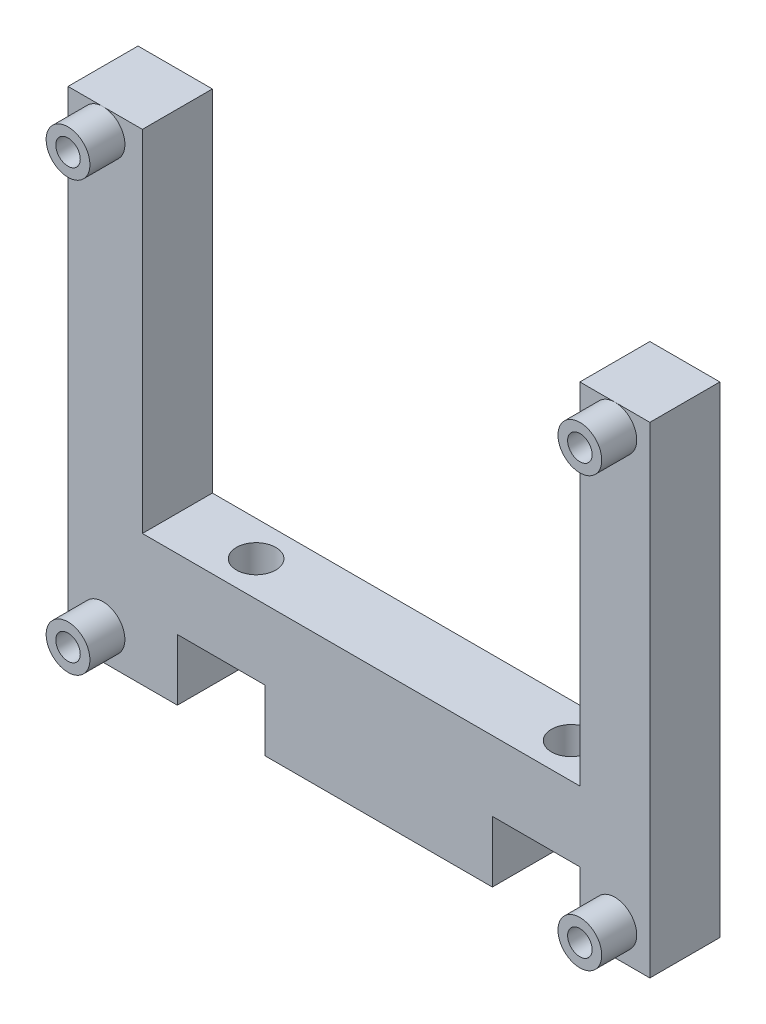
ISO-10303-21;
HEADER;
FILE_DESCRIPTION(('STEP AP214'),'2;1');
FILE_NAME('part.step','',(''),(''),'','','');
FILE_SCHEMA(('AUTOMOTIVE_DESIGN { 1 0 10303 214 1 1 1 1 }'));
ENDSEC;
DATA;
#1=APPLICATION_CONTEXT('core data for automotive mechanical design processes');
#2=APPLICATION_PROTOCOL_DEFINITION('international standard','automotive_design',2000,#1);
#3=PRODUCT_CONTEXT('',#1,'mechanical');
#4=PRODUCT('Part','Part','',(#3));
#5=PRODUCT_RELATED_PRODUCT_CATEGORY('part','',(#4));
#6=PRODUCT_DEFINITION_FORMATION('','',#4);
#7=PRODUCT_DEFINITION_CONTEXT('part definition',#1,'design');
#8=PRODUCT_DEFINITION('design','',#6,#7);
#9=PRODUCT_DEFINITION_SHAPE('','',#8);
#10=(LENGTH_UNIT() NAMED_UNIT(*) SI_UNIT(.MILLI.,.METRE.));
#11=(NAMED_UNIT(*) PLANE_ANGLE_UNIT() SI_UNIT($,.RADIAN.));
#12=(NAMED_UNIT(*) SI_UNIT($,.STERADIAN.) SOLID_ANGLE_UNIT());
#13=UNCERTAINTY_MEASURE_WITH_UNIT(LENGTH_MEASURE(1.E-05),#10,'distance_accuracy_value','');
#14=(GEOMETRIC_REPRESENTATION_CONTEXT(3) GLOBAL_UNCERTAINTY_ASSIGNED_CONTEXT((#13)) GLOBAL_UNIT_ASSIGNED_CONTEXT((#10,
#11,#12)) REPRESENTATION_CONTEXT('',''));
#15=CARTESIAN_POINT('',(0.,0.,0.));
#16=DIRECTION('',(0.,0.,1.));
#17=DIRECTION('',(1.,0.,0.));
#18=AXIS2_PLACEMENT_3D('',#15,#16,#17);
#19=CARTESIAN_POINT('',(33.25,-28.,-8.));
#20=DIRECTION('',(0.,-1.,0.));
#21=DIRECTION('',(1.,0.,0.));
#22=AXIS2_PLACEMENT_3D('',#19,#20,#21);
#23=PLANE('',#22);
#24=DIRECTION('',(0.,0.,-1.));
#25=VECTOR('',#24,1.);
#26=CARTESIAN_POINT('',(-20.75,-28.,0.));
#27=LINE('',#26,#25);
#28=CARTESIAN_POINT('',(-20.75,-28.,0.));
#29=VERTEX_POINT('',#28);
#30=CARTESIAN_POINT('',(-20.75,-28.,-8.));
#31=VERTEX_POINT('',#30);
#32=EDGE_CURVE('E164',#29,#31,#27,.T.);
#33=ORIENTED_EDGE('',*,*,#32,.F.);
#34=DIRECTION('',(1.,0.,0.));
#35=VECTOR('',#34,1.);
#36=CARTESIAN_POINT('',(33.25,-28.,0.));
#37=LINE('',#36,#35);
#38=CARTESIAN_POINT('',(-33.25,-28.,0.));
#39=VERTEX_POINT('',#38);
#40=EDGE_CURVE('E294',#39,#29,#37,.T.);
#41=ORIENTED_EDGE('',*,*,#40,.F.);
#42=DIRECTION('',(0.,0.,1.));
#43=VECTOR('',#42,1.);
#44=CARTESIAN_POINT('',(-33.25,-28.,-8.));
#45=LINE('',#44,#43);
#46=CARTESIAN_POINT('',(-33.25,-28.,-8.));
#47=VERTEX_POINT('',#46);
#48=EDGE_CURVE('E306',#47,#39,#45,.T.);
#49=ORIENTED_EDGE('',*,*,#48,.F.);
#50=DIRECTION('',(1.,0.,0.));
#51=VECTOR('',#50,1.);
#52=CARTESIAN_POINT('',(33.25,-28.,-8.));
#53=LINE('',#52,#51);
#54=EDGE_CURVE('E269',#47,#31,#53,.T.);
#55=ORIENTED_EDGE('',*,*,#54,.T.);
#56=EDGE_LOOP('',(#33,#41,#49,#55));
#57=FACE_BOUND('',#56,.T.);
#58=ADVANCED_FACE('F37',(#57),#23,.T.);
#59=DIRECTION('',(0.,0.,1.));
#60=VECTOR('',#59,1.);
#61=CARTESIAN_POINT('',(-10.75,-28.,0.));
#62=LINE('',#61,#60);
#63=CARTESIAN_POINT('',(-10.75,-28.,-8.));
#64=VERTEX_POINT('',#63);
#65=CARTESIAN_POINT('',(-10.75,-28.,0.));
#66=VERTEX_POINT('',#65);
#67=EDGE_CURVE('E178',#64,#66,#62,.T.);
#68=ORIENTED_EDGE('',*,*,#67,.F.);
#69=CARTESIAN_POINT('',(15.25,-28.,-8.));
#70=VERTEX_POINT('',#69);
#71=EDGE_CURVE('E272',#64,#70,#53,.T.);
#72=ORIENTED_EDGE('',*,*,#71,.T.);
#73=DIRECTION('',(0.,0.,-1.));
#74=VECTOR('',#73,1.);
#75=CARTESIAN_POINT('',(15.25,-28.,0.));
#76=LINE('',#75,#74);
#77=CARTESIAN_POINT('',(15.25,-28.,0.));
#78=VERTEX_POINT('',#77);
#79=EDGE_CURVE('E206',#78,#70,#76,.T.);
#80=ORIENTED_EDGE('',*,*,#79,.F.);
#81=EDGE_CURVE('E297',#66,#78,#37,.T.);
#82=ORIENTED_EDGE('',*,*,#81,.F.);
#83=EDGE_LOOP('',(#68,#72,#80,#82));
#84=FACE_BOUND('',#83,.T.);
#85=ADVANCED_FACE('F346',(#84),#23,.T.);
#86=CARTESIAN_POINT('',(20.25,-9.99999999999999,-4.));
#87=DIRECTION('',(0.,-1.,0.));
#88=DIRECTION('',(1.,0.,0.));
#89=AXIS2_PLACEMENT_3D('',#86,#87,#88);
#90=CYLINDRICAL_SURFACE('',#89,2.25);
#91=CARTESIAN_POINT('',(20.25,-13.,-4.));
#92=DIRECTION('',(0.,1.,0.));
#93=DIRECTION('',(0.,0.,1.));
#94=AXIS2_PLACEMENT_3D('',#91,#92,#93);
#95=CIRCLE('',#94,2.25);
#96=CARTESIAN_POINT('',(20.25,-13.,-1.75));
#97=VERTEX_POINT('',#96);
#98=EDGE_CURVE('E332',#97,#97,#95,.T.);
#99=ORIENTED_EDGE('',*,*,#98,.T.);
#100=EDGE_LOOP('',(#99));
#101=FACE_BOUND('',#100,.T.);
#102=CARTESIAN_POINT('',(20.25,-21.,-4.));
#103=DIRECTION('',(0.,-1.,0.));
#104=DIRECTION('',(1.,0.,0.));
#105=AXIS2_PLACEMENT_3D('',#102,#103,#104);
#106=CIRCLE('',#105,2.25);
#107=CARTESIAN_POINT('',(22.5,-21.,-4.));
#108=VERTEX_POINT('',#107);
#109=EDGE_CURVE('E41',#108,#108,#106,.F.);
#110=ORIENTED_EDGE('',*,*,#109,.F.);
#111=EDGE_LOOP('',(#110));
#112=FACE_BOUND('',#111,.T.);
#113=ADVANCED_FACE('F343',(#101,#112),#90,.F.);
#114=CARTESIAN_POINT('',(-15.75,-10.,-4.));
#115=DIRECTION('',(0.,-1.,0.));
#116=DIRECTION('',(1.,0.,0.));
#117=AXIS2_PLACEMENT_3D('',#114,#115,#116);
#118=CYLINDRICAL_SURFACE('',#117,2.25);
#119=CARTESIAN_POINT('',(-15.75,-13.,-4.));
#120=DIRECTION('',(0.,1.,0.));
#121=DIRECTION('',(0.,0.,1.));
#122=AXIS2_PLACEMENT_3D('',#119,#120,#121);
#123=CIRCLE('',#122,2.25);
#124=CARTESIAN_POINT('',(-15.75,-13.,-1.75));
#125=VERTEX_POINT('',#124);
#126=EDGE_CURVE('E224',#125,#125,#123,.T.);
#127=ORIENTED_EDGE('',*,*,#126,.T.);
#128=EDGE_LOOP('',(#127));
#129=FACE_BOUND('',#128,.T.);
#130=CARTESIAN_POINT('',(-15.75,-21.,-4.));
#131=DIRECTION('',(0.,-1.,0.));
#132=DIRECTION('',(1.,0.,0.));
#133=AXIS2_PLACEMENT_3D('',#130,#131,#132);
#134=CIRCLE('',#133,2.25);
#135=CARTESIAN_POINT('',(-13.5,-21.,-4.));
#136=VERTEX_POINT('',#135);
#137=EDGE_CURVE('E191',#136,#136,#134,.F.);
#138=ORIENTED_EDGE('',*,*,#137,.F.);
#139=EDGE_LOOP('',(#138));
#140=FACE_BOUND('',#139,.T.);
#141=ADVANCED_FACE('F345',(#129,#140),#118,.F.);
#142=CARTESIAN_POINT('',(-29.25,24.5,4.));
#143=DIRECTION('',(0.,0.,1.));
#144=DIRECTION('',(1.,0.,0.));
#145=AXIS2_PLACEMENT_3D('',#142,#143,#144);
#146=PLANE('',#145);
#147=CARTESIAN_POINT('',(-29.25,24.5,4.));
#148=DIRECTION('',(0.,0.,1.));
#149=DIRECTION('',(1.,0.,0.));
#150=AXIS2_PLACEMENT_3D('',#147,#148,#149);
#151=CIRCLE('',#150,2.5);
#152=CARTESIAN_POINT('',(-26.75,24.5,4.));
#153=VERTEX_POINT('',#152);
#154=EDGE_CURVE('E325',#153,#153,#151,.T.);
#155=ORIENTED_EDGE('',*,*,#154,.T.);
#156=EDGE_LOOP('',(#155));
#157=FACE_BOUND('',#156,.T.);
#158=CARTESIAN_POINT('',(-29.25,24.5,4.));
#159=DIRECTION('',(0.,0.,1.));
#160=DIRECTION('',(1.,0.,0.));
#161=AXIS2_PLACEMENT_3D('',#158,#159,#160);
#162=CIRCLE('',#161,1.4);
#163=CARTESIAN_POINT('',(-27.85,24.5,4.));
#164=VERTEX_POINT('',#163);
#165=EDGE_CURVE('E319',#164,#164,#162,.T.);
#166=ORIENTED_EDGE('',*,*,#165,.F.);
#167=EDGE_LOOP('',(#166));
#168=FACE_BOUND('',#167,.T.);
#169=ADVANCED_FACE('F353',(#157,#168),#146,.T.);
#170=CARTESIAN_POINT('',(-29.25,24.5,4.));
#171=DIRECTION('',(0.,0.,-1.));
#172=DIRECTION('',(-1.,0.,0.));
#173=AXIS2_PLACEMENT_3D('',#170,#171,#172);
#174=CYLINDRICAL_SURFACE('',#173,2.5);
#175=ORIENTED_EDGE('',*,*,#154,.F.);
#176=EDGE_LOOP('',(#175));
#177=FACE_BOUND('',#176,.T.);
#178=CARTESIAN_POINT('',(-29.25,24.5,0.));
#179=DIRECTION('',(0.,0.,1.));
#180=DIRECTION('',(1.,0.,0.));
#181=AXIS2_PLACEMENT_3D('',#178,#179,#180);
#182=CIRCLE('',#181,2.5);
#183=CARTESIAN_POINT('',(-29.25,27.,0.));
#184=VERTEX_POINT('',#183);
#185=EDGE_CURVE('E322',#184,#184,#182,.T.);
#186=ORIENTED_EDGE('',*,*,#185,.T.);
#187=EDGE_LOOP('',(#186));
#188=FACE_BOUND('',#187,.T.);
#189=ADVANCED_FACE('F39',(#177,#188),#174,.T.);
#190=CARTESIAN_POINT('',(-29.25,24.5,4.));
#191=DIRECTION('',(0.,0.,-1.));
#192=DIRECTION('',(-1.,0.,0.));
#193=AXIS2_PLACEMENT_3D('',#190,#191,#192);
#194=CYLINDRICAL_SURFACE('',#193,1.4);
#195=ORIENTED_EDGE('',*,*,#165,.T.);
#196=EDGE_LOOP('',(#195));
#197=FACE_BOUND('',#196,.T.);
#198=CARTESIAN_POINT('',(-29.25,24.5,0.));
#199=DIRECTION('',(0.,0.,1.));
#200=DIRECTION('',(1.,0.,0.));
#201=AXIS2_PLACEMENT_3D('',#198,#199,#200);
#202=CIRCLE('',#201,1.4);
#203=CARTESIAN_POINT('',(-27.85,24.5,0.));
#204=VERTEX_POINT('',#203);
#205=EDGE_CURVE('E302',#204,#204,#202,.T.);
#206=ORIENTED_EDGE('',*,*,#205,.F.);
#207=EDGE_LOOP('',(#206));
#208=FACE_BOUND('',#207,.T.);
#209=ADVANCED_FACE('F437',(#197,#208),#194,.F.);
#210=CARTESIAN_POINT('',(0.,0.,0.));
#211=DIRECTION('',(0.,0.,-1.));
#212=DIRECTION('',(-1.,0.,0.));
#213=AXIS2_PLACEMENT_3D('',#210,#211,#212);
#214=PLANE('',#213);
#215=ORIENTED_EDGE('',*,*,#205,.T.);
#216=EDGE_LOOP('',(#215));
#217=FACE_BOUND('',#216,.T.);
#218=ADVANCED_FACE('F428',(#217),#214,.F.);
#219=CARTESIAN_POINT('',(25.25,27.,-8.));
#220=DIRECTION('',(0.,1.,0.));
#221=DIRECTION('',(0.,0.,1.));
#222=AXIS2_PLACEMENT_3D('',#219,#220,#221);
#223=PLANE('',#222);
#224=DIRECTION('',(-1.,0.,0.));
#225=VECTOR('',#224,1.);
#226=CARTESIAN_POINT('',(25.25,27.,0.));
#227=LINE('',#226,#225);
#228=CARTESIAN_POINT('',(33.25,27.,0.));
#229=VERTEX_POINT('',#228);
#230=CARTESIAN_POINT('',(29.25,27.,0.));
#231=VERTEX_POINT('',#230);
#232=EDGE_CURVE('E276',#229,#231,#227,.T.);
#233=ORIENTED_EDGE('',*,*,#232,.F.);
#234=DIRECTION('',(0.,0.,1.));
#235=VECTOR('',#234,1.);
#236=CARTESIAN_POINT('',(33.25,27.,-8.));
#237=LINE('',#236,#235);
#238=CARTESIAN_POINT('',(33.25,27.,-8.));
#239=VERTEX_POINT('',#238);
#240=EDGE_CURVE('E300',#239,#229,#237,.T.);
#241=ORIENTED_EDGE('',*,*,#240,.F.);
#242=DIRECTION('',(-1.,0.,0.));
#243=VECTOR('',#242,1.);
#244=CARTESIAN_POINT('',(25.25,27.,-8.));
#245=LINE('',#244,#243);
#246=CARTESIAN_POINT('',(25.25,27.,-8.));
#247=VERTEX_POINT('',#246);
#248=EDGE_CURVE('E249',#239,#247,#245,.T.);
#249=ORIENTED_EDGE('',*,*,#248,.T.);
#250=DIRECTION('',(0.,0.,1.));
#251=VECTOR('',#250,1.);
#252=CARTESIAN_POINT('',(25.25,27.,-8.));
#253=LINE('',#252,#251);
#254=CARTESIAN_POINT('',(25.25,27.,0.));
#255=VERTEX_POINT('',#254);
#256=EDGE_CURVE('E275',#247,#255,#253,.T.);
#257=ORIENTED_EDGE('',*,*,#256,.T.);
#258=EDGE_CURVE('E246',#231,#255,#227,.T.);
#259=ORIENTED_EDGE('',*,*,#258,.F.);
#260=EDGE_LOOP('',(#233,#241,#249,#257,#259));
#261=FACE_BOUND('',#260,.T.);
#262=ADVANCED_FACE('F378',(#261),#223,.T.);
#263=CARTESIAN_POINT('',(33.25,27.,-8.));
#264=DIRECTION('',(1.,0.,0.));
#265=DIRECTION('',(0.,1.,0.));
#266=AXIS2_PLACEMENT_3D('',#263,#264,#265);
#267=PLANE('',#266);
#268=DIRECTION('',(0.,1.,0.));
#269=VECTOR('',#268,1.);
#270=CARTESIAN_POINT('',(33.25,27.,0.));
#271=LINE('',#270,#269);
#272=CARTESIAN_POINT('',(33.25,-28.,0.));
#273=VERTEX_POINT('',#272);
#274=EDGE_CURVE('E253',#273,#229,#271,.T.);
#275=ORIENTED_EDGE('',*,*,#274,.F.);
#276=DIRECTION('',(0.,0.,1.));
#277=VECTOR('',#276,1.);
#278=CARTESIAN_POINT('',(33.25,-28.,-8.));
#279=LINE('',#278,#277);
#280=CARTESIAN_POINT('',(33.25,-28.,-8.));
#281=VERTEX_POINT('',#280);
#282=EDGE_CURVE('E303',#281,#273,#279,.T.);
#283=ORIENTED_EDGE('',*,*,#282,.F.);
#284=DIRECTION('',(0.,1.,0.));
#285=VECTOR('',#284,1.);
#286=CARTESIAN_POINT('',(33.25,27.,-8.));
#287=LINE('',#286,#285);
#288=EDGE_CURVE('E271',#281,#239,#287,.T.);
#289=ORIENTED_EDGE('',*,*,#288,.T.);
#290=ORIENTED_EDGE('',*,*,#240,.T.);
#291=EDGE_LOOP('',(#275,#283,#289,#290));
#292=FACE_BOUND('',#291,.T.);
#293=ADVANCED_FACE('F369',(#292),#267,.T.);
#294=DIRECTION('',(0.,0.,1.));
#295=VECTOR('',#294,1.);
#296=CARTESIAN_POINT('',(25.25,-28.,0.));
#297=LINE('',#296,#295);
#298=CARTESIAN_POINT('',(25.25,-28.,-8.));
#299=VERTEX_POINT('',#298);
#300=CARTESIAN_POINT('',(25.25,-28.,0.));
#301=VERTEX_POINT('',#300);
#302=EDGE_CURVE('E200',#299,#301,#297,.T.);
#303=ORIENTED_EDGE('',*,*,#302,.F.);
#304=EDGE_CURVE('E268',#299,#281,#53,.T.);
#305=ORIENTED_EDGE('',*,*,#304,.T.);
#306=ORIENTED_EDGE('',*,*,#282,.T.);
#307=EDGE_CURVE('E293',#301,#273,#37,.T.);
#308=ORIENTED_EDGE('',*,*,#307,.F.);
#309=EDGE_LOOP('',(#303,#305,#306,#308));
#310=FACE_BOUND('',#309,.T.);
#311=ADVANCED_FACE('F358',(#310),#23,.T.);
#312=CARTESIAN_POINT('',(-33.25,-28.,-8.));
#313=DIRECTION('',(-1.,0.,0.));
#314=DIRECTION('',(0.,0.,1.));
#315=AXIS2_PLACEMENT_3D('',#312,#313,#314);
#316=PLANE('',#315);
#317=DIRECTION('',(0.,-1.,0.));
#318=VECTOR('',#317,1.);
#319=CARTESIAN_POINT('',(-33.25,-28.,0.));
#320=LINE('',#319,#318);
#321=CARTESIAN_POINT('',(-33.25,27.,0.));
#322=VERTEX_POINT('',#321);
#323=EDGE_CURVE('E290',#322,#39,#320,.T.);
#324=ORIENTED_EDGE('',*,*,#323,.F.);
#325=DIRECTION('',(0.,0.,1.));
#326=VECTOR('',#325,1.);
#327=CARTESIAN_POINT('',(-33.25,27.,-8.));
#328=LINE('',#327,#326);
#329=CARTESIAN_POINT('',(-33.25,27.,-8.));
#330=VERTEX_POINT('',#329);
#331=EDGE_CURVE('E308',#330,#322,#328,.T.);
#332=ORIENTED_EDGE('',*,*,#331,.F.);
#333=DIRECTION('',(0.,-1.,0.));
#334=VECTOR('',#333,1.);
#335=CARTESIAN_POINT('',(-33.25,-28.,-8.));
#336=LINE('',#335,#334);
#337=EDGE_CURVE('E265',#330,#47,#336,.T.);
#338=ORIENTED_EDGE('',*,*,#337,.T.);
#339=ORIENTED_EDGE('',*,*,#48,.T.);
#340=EDGE_LOOP('',(#324,#332,#338,#339));
#341=FACE_BOUND('',#340,.T.);
#342=ADVANCED_FACE('F368',(#341),#316,.T.);
#343=CARTESIAN_POINT('',(-33.25,27.,-8.));
#344=DIRECTION('',(0.,1.,0.));
#345=DIRECTION('',(-1.,0.,0.));
#346=AXIS2_PLACEMENT_3D('',#343,#344,#345);
#347=PLANE('',#346);
#348=DIRECTION('',(-1.,0.,0.));
#349=VECTOR('',#348,1.);
#350=CARTESIAN_POINT('',(-33.25,27.,0.));
#351=LINE('',#350,#349);
#352=CARTESIAN_POINT('',(-24.75,27.,0.));
#353=VERTEX_POINT('',#352);
#354=EDGE_CURVE('E288',#353,#184,#351,.T.);
#355=ORIENTED_EDGE('',*,*,#354,.F.);
#356=DIRECTION('',(0.,0.,1.));
#357=VECTOR('',#356,1.);
#358=CARTESIAN_POINT('',(-24.75,27.,-8.));
#359=LINE('',#358,#357);
#360=CARTESIAN_POINT('',(-24.75,27.,-8.));
#361=VERTEX_POINT('',#360);
#362=EDGE_CURVE('E311',#361,#353,#359,.T.);
#363=ORIENTED_EDGE('',*,*,#362,.F.);
#364=DIRECTION('',(-1.,0.,0.));
#365=VECTOR('',#364,1.);
#366=CARTESIAN_POINT('',(-33.25,27.,-8.));
#367=LINE('',#366,#365);
#368=EDGE_CURVE('E262',#361,#330,#367,.T.);
#369=ORIENTED_EDGE('',*,*,#368,.T.);
#370=ORIENTED_EDGE('',*,*,#331,.T.);
#371=EDGE_CURVE('E287',#184,#322,#351,.T.);
#372=ORIENTED_EDGE('',*,*,#371,.F.);
#373=EDGE_LOOP('',(#355,#363,#369,#370,#372));
#374=FACE_BOUND('',#373,.T.);
#375=ADVANCED_FACE('F375',(#374),#347,.T.);
#376=CARTESIAN_POINT('',(-24.75,27.,-8.));
#377=DIRECTION('',(1.,0.,0.));
#378=DIRECTION('',(0.,1.,0.));
#379=AXIS2_PLACEMENT_3D('',#376,#377,#378);
#380=PLANE('',#379);
#381=DIRECTION('',(0.,1.,0.));
#382=VECTOR('',#381,1.);
#383=CARTESIAN_POINT('',(-24.75,27.,0.));
#384=LINE('',#383,#382);
#385=CARTESIAN_POINT('',(-24.75,-13.,0.));
#386=VERTEX_POINT('',#385);
#387=EDGE_CURVE('E284',#386,#353,#384,.T.);
#388=ORIENTED_EDGE('',*,*,#387,.F.);
#389=DIRECTION('',(0.,0.,1.));
#390=VECTOR('',#389,1.);
#391=CARTESIAN_POINT('',(-24.75,-13.,-8.));
#392=LINE('',#391,#390);
#393=CARTESIAN_POINT('',(-24.75,-13.,-8.));
#394=VERTEX_POINT('',#393);
#395=EDGE_CURVE('E313',#394,#386,#392,.T.);
#396=ORIENTED_EDGE('',*,*,#395,.F.);
#397=DIRECTION('',(0.,1.,0.));
#398=VECTOR('',#397,1.);
#399=CARTESIAN_POINT('',(-24.75,27.,-8.));
#400=LINE('',#399,#398);
#401=EDGE_CURVE('E259',#394,#361,#400,.T.);
#402=ORIENTED_EDGE('',*,*,#401,.T.);
#403=ORIENTED_EDGE('',*,*,#362,.T.);
#404=EDGE_LOOP('',(#388,#396,#402,#403));
#405=FACE_BOUND('',#404,.T.);
#406=ADVANCED_FACE('F574',(#405),#380,.T.);
#407=CARTESIAN_POINT('',(-24.75,-13.,-8.));
#408=DIRECTION('',(0.,1.,0.));
#409=DIRECTION('',(0.,0.,1.));
#410=AXIS2_PLACEMENT_3D('',#407,#408,#409);
#411=PLANE('',#410);
#412=ORIENTED_EDGE('',*,*,#126,.F.);
#413=EDGE_LOOP('',(#412));
#414=FACE_BOUND('',#413,.T.);
#415=ORIENTED_EDGE('',*,*,#98,.F.);
#416=EDGE_LOOP('',(#415));
#417=FACE_BOUND('',#416,.T.);
#418=DIRECTION('',(-1.,0.,0.));
#419=VECTOR('',#418,1.);
#420=CARTESIAN_POINT('',(-24.75,-13.,0.));
#421=LINE('',#420,#419);
#422=CARTESIAN_POINT('',(25.25,-13.,0.));
#423=VERTEX_POINT('',#422);
#424=EDGE_CURVE('E281',#423,#386,#421,.T.);
#425=ORIENTED_EDGE('',*,*,#424,.F.);
#426=DIRECTION('',(0.,0.,1.));
#427=VECTOR('',#426,1.);
#428=CARTESIAN_POINT('',(25.25,-13.,-8.));
#429=LINE('',#428,#427);
#430=CARTESIAN_POINT('',(25.25,-13.,-8.));
#431=VERTEX_POINT('',#430);
#432=EDGE_CURVE('E315',#431,#423,#429,.T.);
#433=ORIENTED_EDGE('',*,*,#432,.F.);
#434=DIRECTION('',(-1.,0.,0.));
#435=VECTOR('',#434,1.);
#436=CARTESIAN_POINT('',(-24.75,-13.,-8.));
#437=LINE('',#436,#435);
#438=EDGE_CURVE('E256',#431,#394,#437,.T.);
#439=ORIENTED_EDGE('',*,*,#438,.T.);
#440=ORIENTED_EDGE('',*,*,#395,.T.);
#441=EDGE_LOOP('',(#425,#433,#439,#440));
#442=FACE_BOUND('',#441,.T.);
#443=ADVANCED_FACE('F577',(#414,#417,#442),#411,.T.);
#444=CARTESIAN_POINT('',(25.25,-13.,-8.));
#445=DIRECTION('',(-1.,0.,0.));
#446=DIRECTION('',(0.,0.,1.));
#447=AXIS2_PLACEMENT_3D('',#444,#445,#446);
#448=PLANE('',#447);
#449=DIRECTION('',(0.,-1.,0.));
#450=VECTOR('',#449,1.);
#451=CARTESIAN_POINT('',(25.25,-13.,0.));
#452=LINE('',#451,#450);
#453=EDGE_CURVE('E278',#255,#423,#452,.T.);
#454=ORIENTED_EDGE('',*,*,#453,.F.);
#455=ORIENTED_EDGE('',*,*,#256,.F.);
#456=DIRECTION('',(0.,-1.,0.));
#457=VECTOR('',#456,1.);
#458=CARTESIAN_POINT('',(25.25,-13.,-8.));
#459=LINE('',#458,#457);
#460=EDGE_CURVE('E252',#247,#431,#459,.T.);
#461=ORIENTED_EDGE('',*,*,#460,.T.);
#462=ORIENTED_EDGE('',*,*,#432,.T.);
#463=EDGE_LOOP('',(#454,#455,#461,#462));
#464=FACE_BOUND('',#463,.T.);
#465=ADVANCED_FACE('F425',(#464),#448,.T.);
#466=CARTESIAN_POINT('',(0.,0.,-8.));
#467=DIRECTION('',(0.,0.,-1.));
#468=DIRECTION('',(-1.,0.,0.));
#469=AXIS2_PLACEMENT_3D('',#466,#467,#468);
#470=PLANE('',#469);
#471=DIRECTION('',(0.,-1.,0.));
#472=VECTOR('',#471,1.);
#473=CARTESIAN_POINT('',(-20.75,-21.,-8.));
#474=LINE('',#473,#472);
#475=CARTESIAN_POINT('',(-20.75,-21.,-8.));
#476=VERTEX_POINT('',#475);
#477=EDGE_CURVE('E159',#476,#31,#474,.T.);
#478=ORIENTED_EDGE('',*,*,#477,.T.);
#479=ORIENTED_EDGE('',*,*,#54,.F.);
#480=ORIENTED_EDGE('',*,*,#337,.F.);
#481=ORIENTED_EDGE('',*,*,#368,.F.);
#482=ORIENTED_EDGE('',*,*,#401,.F.);
#483=ORIENTED_EDGE('',*,*,#438,.F.);
#484=ORIENTED_EDGE('',*,*,#460,.F.);
#485=ORIENTED_EDGE('',*,*,#248,.F.);
#486=ORIENTED_EDGE('',*,*,#288,.F.);
#487=ORIENTED_EDGE('',*,*,#304,.F.);
#488=DIRECTION('',(0.,-1.,0.));
#489=VECTOR('',#488,1.);
#490=CARTESIAN_POINT('',(25.25,-21.,-8.));
#491=LINE('',#490,#489);
#492=CARTESIAN_POINT('',(25.25,-21.,-8.));
#493=VERTEX_POINT('',#492);
#494=EDGE_CURVE('E213',#493,#299,#491,.T.);
#495=ORIENTED_EDGE('',*,*,#494,.F.);
#496=DIRECTION('',(1.,0.,0.));
#497=VECTOR('',#496,1.);
#498=CARTESIAN_POINT('',(15.25,-21.,-8.));
#499=LINE('',#498,#497);
#500=CARTESIAN_POINT('',(15.25,-21.,-8.));
#501=VERTEX_POINT('',#500);
#502=EDGE_CURVE('E199',#501,#493,#499,.T.);
#503=ORIENTED_EDGE('',*,*,#502,.F.);
#504=DIRECTION('',(0.,-1.,0.));
#505=VECTOR('',#504,1.);
#506=CARTESIAN_POINT('',(15.25,-21.,-8.));
#507=LINE('',#506,#505);
#508=EDGE_CURVE('E205',#501,#70,#507,.T.);
#509=ORIENTED_EDGE('',*,*,#508,.T.);
#510=ORIENTED_EDGE('',*,*,#71,.F.);
#511=DIRECTION('',(0.,-1.,0.));
#512=VECTOR('',#511,1.);
#513=CARTESIAN_POINT('',(-10.75,-21.,-8.));
#514=LINE('',#513,#512);
#515=CARTESIAN_POINT('',(-10.75,-21.,-8.));
#516=VERTEX_POINT('',#515);
#517=EDGE_CURVE('E169',#516,#64,#514,.T.);
#518=ORIENTED_EDGE('',*,*,#517,.F.);
#519=DIRECTION('',(1.,0.,0.));
#520=VECTOR('',#519,1.);
#521=CARTESIAN_POINT('',(-20.75,-21.,-8.));
#522=LINE('',#521,#520);
#523=EDGE_CURVE('E174',#476,#516,#522,.T.);
#524=ORIENTED_EDGE('',*,*,#523,.F.);
#525=EDGE_LOOP('',(#478,#479,#480,#481,#482,#483,#484,#485,#486,#487,#495,#503,#509,#510,#518,#524));
#526=FACE_BOUND('',#525,.T.);
#527=ADVANCED_FACE('F180',(#526),#470,.T.);
#528=ORIENTED_EDGE('',*,*,#40,.T.);
#529=DIRECTION('',(0.,-1.,0.));
#530=VECTOR('',#529,1.);
#531=CARTESIAN_POINT('',(-20.75,-21.,0.));
#532=LINE('',#531,#530);
#533=CARTESIAN_POINT('',(-20.75,-21.,0.));
#534=VERTEX_POINT('',#533);
#535=EDGE_CURVE('E189',#534,#29,#532,.T.);
#536=ORIENTED_EDGE('',*,*,#535,.F.);
#537=DIRECTION('',(-1.,0.,0.));
#538=VECTOR('',#537,1.);
#539=CARTESIAN_POINT('',(-20.75,-21.,0.));
#540=LINE('',#539,#538);
#541=CARTESIAN_POINT('',(-10.75,-21.,0.));
#542=VERTEX_POINT('',#541);
#543=EDGE_CURVE('E170',#542,#534,#540,.T.);
#544=ORIENTED_EDGE('',*,*,#543,.F.);
#545=DIRECTION('',(0.,-1.,0.));
#546=VECTOR('',#545,1.);
#547=CARTESIAN_POINT('',(-10.75,-21.,0.));
#548=LINE('',#547,#546);
#549=EDGE_CURVE('E192',#542,#66,#548,.T.);
#550=ORIENTED_EDGE('',*,*,#549,.T.);
#551=ORIENTED_EDGE('',*,*,#81,.T.);
#552=DIRECTION('',(0.,-1.,0.));
#553=VECTOR('',#552,1.);
#554=CARTESIAN_POINT('',(15.25,-21.,0.));
#555=LINE('',#554,#553);
#556=CARTESIAN_POINT('',(15.25,-21.,0.));
#557=VERTEX_POINT('',#556);
#558=EDGE_CURVE('E187',#557,#78,#555,.T.);
#559=ORIENTED_EDGE('',*,*,#558,.F.);
#560=DIRECTION('',(-1.,0.,0.));
#561=VECTOR('',#560,1.);
#562=CARTESIAN_POINT('',(15.25,-21.,0.));
#563=LINE('',#562,#561);
#564=CARTESIAN_POINT('',(25.25,-21.,0.));
#565=VERTEX_POINT('',#564);
#566=EDGE_CURVE('E203',#565,#557,#563,.T.);
#567=ORIENTED_EDGE('',*,*,#566,.F.);
#568=DIRECTION('',(0.,-1.,0.));
#569=VECTOR('',#568,1.);
#570=CARTESIAN_POINT('',(25.25,-21.,0.));
#571=LINE('',#570,#569);
#572=EDGE_CURVE('E210',#565,#301,#571,.T.);
#573=ORIENTED_EDGE('',*,*,#572,.T.);
#574=ORIENTED_EDGE('',*,*,#307,.T.);
#575=ORIENTED_EDGE('',*,*,#274,.T.);
#576=ORIENTED_EDGE('',*,*,#232,.T.);
#577=CARTESIAN_POINT('',(29.25,24.5,0.));
#578=DIRECTION('',(0.,0.,1.));
#579=DIRECTION('',(1.,0.,0.));
#580=AXIS2_PLACEMENT_3D('',#577,#578,#579);
#581=CIRCLE('',#580,2.5);
#582=EDGE_CURVE('E240',#231,#231,#581,.T.);
#583=ORIENTED_EDGE('',*,*,#582,.F.);
#584=ORIENTED_EDGE('',*,*,#258,.T.);
#585=ORIENTED_EDGE('',*,*,#453,.T.);
#586=ORIENTED_EDGE('',*,*,#424,.T.);
#587=ORIENTED_EDGE('',*,*,#387,.T.);
#588=ORIENTED_EDGE('',*,*,#354,.T.);
#589=ORIENTED_EDGE('',*,*,#185,.F.);
#590=ORIENTED_EDGE('',*,*,#371,.T.);
#591=ORIENTED_EDGE('',*,*,#323,.T.);
#592=EDGE_LOOP('',(#528,#536,#544,#550,#551,#559,#567,#573,#574,#575,#576,#583,#584,#585,#586,
#587,#588,#589,#590,#591));
#593=FACE_BOUND('',#592,.T.);
#594=CARTESIAN_POINT('',(-29.25,-24.5,0.));
#595=DIRECTION('',(0.,0.,-1.));
#596=DIRECTION('',(-1.,0.,0.));
#597=AXIS2_PLACEMENT_3D('',#594,#595,#596);
#598=CIRCLE('',#597,2.5);
#599=CARTESIAN_POINT('',(-31.75,-24.5,0.));
#600=VERTEX_POINT('',#599);
#601=EDGE_CURVE('E11',#600,#600,#598,.F.);
#602=ORIENTED_EDGE('',*,*,#601,.F.);
#603=EDGE_LOOP('',(#602));
#604=FACE_BOUND('',#603,.T.);
#605=CARTESIAN_POINT('',(29.25,-24.5,0.));
#606=DIRECTION('',(0.,0.,-1.));
#607=DIRECTION('',(-1.,0.,0.));
#608=AXIS2_PLACEMENT_3D('',#605,#606,#607);
#609=CIRCLE('',#608,2.5);
#610=CARTESIAN_POINT('',(26.75,-24.5,0.));
#611=VERTEX_POINT('',#610);
#612=EDGE_CURVE('E46',#611,#611,#609,.F.);
#613=ORIENTED_EDGE('',*,*,#612,.F.);
#614=EDGE_LOOP('',(#613));
#615=FACE_BOUND('',#614,.T.);
#616=ADVANCED_FACE('F399',(#593,#604,#615),#214,.F.);
#617=CARTESIAN_POINT('',(29.25,24.5,4.));
#618=DIRECTION('',(0.,0.,1.));
#619=DIRECTION('',(1.,0.,0.));
#620=AXIS2_PLACEMENT_3D('',#617,#618,#619);
#621=PLANE('',#620);
#622=CARTESIAN_POINT('',(29.25,24.5,4.));
#623=DIRECTION('',(0.,0.,1.));
#624=DIRECTION('',(1.,0.,0.));
#625=AXIS2_PLACEMENT_3D('',#622,#623,#624);
#626=CIRCLE('',#625,2.5);
#627=CARTESIAN_POINT('',(31.75,24.5,4.));
#628=VERTEX_POINT('',#627);
#629=EDGE_CURVE('E243',#628,#628,#626,.T.);
#630=ORIENTED_EDGE('',*,*,#629,.T.);
#631=EDGE_LOOP('',(#630));
#632=FACE_BOUND('',#631,.T.);
#633=CARTESIAN_POINT('',(29.25,24.5,4.));
#634=DIRECTION('',(0.,0.,1.));
#635=DIRECTION('',(1.,0.,0.));
#636=AXIS2_PLACEMENT_3D('',#633,#634,#635);
#637=CIRCLE('',#636,1.4);
#638=CARTESIAN_POINT('',(30.65,24.5,4.));
#639=VERTEX_POINT('',#638);
#640=EDGE_CURVE('E237',#639,#639,#637,.T.);
#641=ORIENTED_EDGE('',*,*,#640,.F.);
#642=EDGE_LOOP('',(#641));
#643=FACE_BOUND('',#642,.T.);
#644=ADVANCED_FACE('F410',(#632,#643),#621,.T.);
#645=CARTESIAN_POINT('',(29.25,24.5,4.));
#646=DIRECTION('',(0.,0.,-1.));
#647=DIRECTION('',(-1.,0.,0.));
#648=AXIS2_PLACEMENT_3D('',#645,#646,#647);
#649=CYLINDRICAL_SURFACE('',#648,2.5);
#650=ORIENTED_EDGE('',*,*,#629,.F.);
#651=EDGE_LOOP('',(#650));
#652=FACE_BOUND('',#651,.T.);
#653=ORIENTED_EDGE('',*,*,#582,.T.);
#654=EDGE_LOOP('',(#653));
#655=FACE_BOUND('',#654,.T.);
#656=ADVANCED_FACE('F407',(#652,#655),#649,.T.);
#657=CARTESIAN_POINT('',(29.25,24.5,4.));
#658=DIRECTION('',(0.,0.,-1.));
#659=DIRECTION('',(-1.,0.,0.));
#660=AXIS2_PLACEMENT_3D('',#657,#658,#659);
#661=CYLINDRICAL_SURFACE('',#660,1.4);
#662=ORIENTED_EDGE('',*,*,#640,.T.);
#663=EDGE_LOOP('',(#662));
#664=FACE_BOUND('',#663,.T.);
#665=CARTESIAN_POINT('',(29.25,24.5,0.));
#666=DIRECTION('',(0.,0.,1.));
#667=DIRECTION('',(1.,0.,0.));
#668=AXIS2_PLACEMENT_3D('',#665,#666,#667);
#669=CIRCLE('',#668,1.4);
#670=CARTESIAN_POINT('',(30.65,24.5,0.));
#671=VERTEX_POINT('',#670);
#672=EDGE_CURVE('E236',#671,#671,#669,.T.);
#673=ORIENTED_EDGE('',*,*,#672,.F.);
#674=EDGE_LOOP('',(#673));
#675=FACE_BOUND('',#674,.T.);
#676=ADVANCED_FACE('F409',(#664,#675),#661,.F.);
#677=ORIENTED_EDGE('',*,*,#672,.T.);
#678=EDGE_LOOP('',(#677));
#679=FACE_BOUND('',#678,.T.);
#680=ADVANCED_FACE('F417',(#679),#214,.F.);
#681=CARTESIAN_POINT('',(29.25,-24.5,4.));
#682=DIRECTION('',(0.,0.,1.));
#683=DIRECTION('',(1.,0.,0.));
#684=AXIS2_PLACEMENT_3D('',#681,#682,#683);
#685=PLANE('',#684);
#686=CARTESIAN_POINT('',(29.25,-24.5,4.));
#687=DIRECTION('',(0.,0.,1.));
#688=DIRECTION('',(1.,0.,0.));
#689=AXIS2_PLACEMENT_3D('',#686,#687,#688);
#690=CIRCLE('',#689,2.5);
#691=CARTESIAN_POINT('',(31.75,-24.5,4.));
#692=VERTEX_POINT('',#691);
#693=EDGE_CURVE('E231',#692,#692,#690,.T.);
#694=ORIENTED_EDGE('',*,*,#693,.T.);
#695=EDGE_LOOP('',(#694));
#696=FACE_BOUND('',#695,.T.);
#697=CARTESIAN_POINT('',(29.25,-24.5,4.));
#698=DIRECTION('',(0.,0.,1.));
#699=DIRECTION('',(1.,0.,0.));
#700=AXIS2_PLACEMENT_3D('',#697,#698,#699);
#701=CIRCLE('',#700,1.4);
#702=CARTESIAN_POINT('',(30.65,-24.5,4.));
#703=VERTEX_POINT('',#702);
#704=EDGE_CURVE('E228',#703,#703,#701,.T.);
#705=ORIENTED_EDGE('',*,*,#704,.F.);
#706=EDGE_LOOP('',(#705));
#707=FACE_BOUND('',#706,.T.);
#708=ADVANCED_FACE('F447',(#696,#707),#685,.T.);
#709=CARTESIAN_POINT('',(29.25,-24.5,4.));
#710=DIRECTION('',(0.,0.,-1.));
#711=DIRECTION('',(-1.,0.,0.));
#712=AXIS2_PLACEMENT_3D('',#709,#710,#711);
#713=CYLINDRICAL_SURFACE('',#712,2.5);
#714=ORIENTED_EDGE('',*,*,#693,.F.);
#715=EDGE_LOOP('',(#714));
#716=FACE_BOUND('',#715,.T.);
#717=ORIENTED_EDGE('',*,*,#612,.T.);
#718=EDGE_LOOP('',(#717));
#719=FACE_BOUND('',#718,.T.);
#720=ADVANCED_FACE('F452',(#716,#719),#713,.T.);
#721=CARTESIAN_POINT('',(29.25,-24.5,4.));
#722=DIRECTION('',(0.,0.,-1.));
#723=DIRECTION('',(-1.,0.,0.));
#724=AXIS2_PLACEMENT_3D('',#721,#722,#723);
#725=CYLINDRICAL_SURFACE('',#724,1.4);
#726=ORIENTED_EDGE('',*,*,#704,.T.);
#727=EDGE_LOOP('',(#726));
#728=FACE_BOUND('',#727,.T.);
#729=CARTESIAN_POINT('',(29.25,-24.5,0.));
#730=DIRECTION('',(0.,0.,1.));
#731=DIRECTION('',(1.,0.,0.));
#732=AXIS2_PLACEMENT_3D('',#729,#730,#731);
#733=CIRCLE('',#732,1.4);
#734=CARTESIAN_POINT('',(30.65,-24.5,0.));
#735=VERTEX_POINT('',#734);
#736=EDGE_CURVE('E227',#735,#735,#733,.T.);
#737=ORIENTED_EDGE('',*,*,#736,.F.);
#738=EDGE_LOOP('',(#737));
#739=FACE_BOUND('',#738,.T.);
#740=ADVANCED_FACE('F457',(#728,#739),#725,.F.);
#741=ORIENTED_EDGE('',*,*,#736,.T.);
#742=EDGE_LOOP('',(#741));
#743=FACE_BOUND('',#742,.T.);
#744=ADVANCED_FACE('F435',(#743),#214,.F.);
#745=CARTESIAN_POINT('',(-29.25,-24.5,4.));
#746=DIRECTION('',(0.,0.,1.));
#747=DIRECTION('',(1.,0.,0.));
#748=AXIS2_PLACEMENT_3D('',#745,#746,#747);
#749=PLANE('',#748);
#750=CARTESIAN_POINT('',(-29.25,-24.5,4.));
#751=DIRECTION('',(0.,0.,1.));
#752=DIRECTION('',(1.,0.,0.));
#753=AXIS2_PLACEMENT_3D('',#750,#751,#752);
#754=CIRCLE('',#753,2.5);
#755=CARTESIAN_POINT('',(-26.75,-24.5,4.));
#756=VERTEX_POINT('',#755);
#757=EDGE_CURVE('E220',#756,#756,#754,.T.);
#758=ORIENTED_EDGE('',*,*,#757,.T.);
#759=EDGE_LOOP('',(#758));
#760=FACE_BOUND('',#759,.T.);
#761=CARTESIAN_POINT('',(-29.25,-24.5,4.));
#762=DIRECTION('',(0.,0.,1.));
#763=DIRECTION('',(1.,0.,0.));
#764=AXIS2_PLACEMENT_3D('',#761,#762,#763);
#765=CIRCLE('',#764,1.4);
#766=CARTESIAN_POINT('',(-27.85,-24.5,4.));
#767=VERTEX_POINT('',#766);
#768=EDGE_CURVE('E217',#767,#767,#765,.T.);
#769=ORIENTED_EDGE('',*,*,#768,.F.);
#770=EDGE_LOOP('',(#769));
#771=FACE_BOUND('',#770,.T.);
#772=ADVANCED_FACE('F456',(#760,#771),#749,.T.);
#773=CARTESIAN_POINT('',(-29.25,-24.5,4.));
#774=DIRECTION('',(0.,0.,-1.));
#775=DIRECTION('',(-1.,0.,0.));
#776=AXIS2_PLACEMENT_3D('',#773,#774,#775);
#777=CYLINDRICAL_SURFACE('',#776,2.5);
#778=ORIENTED_EDGE('',*,*,#757,.F.);
#779=EDGE_LOOP('',(#778));
#780=FACE_BOUND('',#779,.T.);
#781=ORIENTED_EDGE('',*,*,#601,.T.);
#782=EDGE_LOOP('',(#781));
#783=FACE_BOUND('',#782,.T.);
#784=ADVANCED_FACE('F463',(#780,#783),#777,.T.);
#785=CARTESIAN_POINT('',(-29.25,-24.5,4.));
#786=DIRECTION('',(0.,0.,-1.));
#787=DIRECTION('',(-1.,0.,0.));
#788=AXIS2_PLACEMENT_3D('',#785,#786,#787);
#789=CYLINDRICAL_SURFACE('',#788,1.4);
#790=ORIENTED_EDGE('',*,*,#768,.T.);
#791=EDGE_LOOP('',(#790));
#792=FACE_BOUND('',#791,.T.);
#793=CARTESIAN_POINT('',(-29.25,-24.5,0.));
#794=DIRECTION('',(0.,0.,1.));
#795=DIRECTION('',(1.,0.,0.));
#796=AXIS2_PLACEMENT_3D('',#793,#794,#795);
#797=CIRCLE('',#796,1.4);
#798=CARTESIAN_POINT('',(-27.85,-24.5,0.));
#799=VERTEX_POINT('',#798);
#800=EDGE_CURVE('E221',#799,#799,#797,.T.);
#801=ORIENTED_EDGE('',*,*,#800,.F.);
#802=EDGE_LOOP('',(#801));
#803=FACE_BOUND('',#802,.T.);
#804=ADVANCED_FACE('F433',(#792,#803),#789,.F.);
#805=ORIENTED_EDGE('',*,*,#800,.T.);
#806=EDGE_LOOP('',(#805));
#807=FACE_BOUND('',#806,.T.);
#808=ADVANCED_FACE('F427',(#807),#214,.F.);
#809=CARTESIAN_POINT('',(0.,-21.,0.));
#810=DIRECTION('',(0.,-1.,0.));
#811=DIRECTION('',(1.,0.,0.));
#812=AXIS2_PLACEMENT_3D('',#809,#810,#811);
#813=PLANE('',#812);
#814=DIRECTION('',(0.,0.,-1.));
#815=VECTOR('',#814,1.);
#816=CARTESIAN_POINT('',(-20.75,-21.,0.));
#817=LINE('',#816,#815);
#818=EDGE_CURVE('E162',#534,#476,#817,.T.);
#819=ORIENTED_EDGE('',*,*,#818,.T.);
#820=ORIENTED_EDGE('',*,*,#523,.T.);
#821=DIRECTION('',(0.,0.,1.));
#822=VECTOR('',#821,1.);
#823=CARTESIAN_POINT('',(-10.75,-21.,0.));
#824=LINE('',#823,#822);
#825=EDGE_CURVE('E54',#516,#542,#824,.T.);
#826=ORIENTED_EDGE('',*,*,#825,.T.);
#827=ORIENTED_EDGE('',*,*,#543,.T.);
#828=EDGE_LOOP('',(#819,#820,#826,#827));
#829=FACE_BOUND('',#828,.T.);
#830=ORIENTED_EDGE('',*,*,#137,.T.);
#831=EDGE_LOOP('',(#830));
#832=FACE_BOUND('',#831,.T.);
#833=ADVANCED_FACE('F172',(#829,#832),#813,.T.);
#834=CARTESIAN_POINT('',(-20.75,-21.,0.));
#835=DIRECTION('',(-1.,0.,0.));
#836=DIRECTION('',(0.,-1.,0.));
#837=AXIS2_PLACEMENT_3D('',#834,#835,#836);
#838=PLANE('',#837);
#839=ORIENTED_EDGE('',*,*,#32,.T.);
#840=ORIENTED_EDGE('',*,*,#477,.F.);
#841=ORIENTED_EDGE('',*,*,#818,.F.);
#842=ORIENTED_EDGE('',*,*,#535,.T.);
#843=EDGE_LOOP('',(#839,#840,#841,#842));
#844=FACE_BOUND('',#843,.T.);
#845=ADVANCED_FACE('F161',(#844),#838,.F.);
#846=CARTESIAN_POINT('',(-10.75,-21.,0.));
#847=DIRECTION('',(1.,0.,0.));
#848=DIRECTION('',(0.,0.,-1.));
#849=AXIS2_PLACEMENT_3D('',#846,#847,#848);
#850=PLANE('',#849);
#851=ORIENTED_EDGE('',*,*,#67,.T.);
#852=ORIENTED_EDGE('',*,*,#549,.F.);
#853=ORIENTED_EDGE('',*,*,#825,.F.);
#854=ORIENTED_EDGE('',*,*,#517,.T.);
#855=EDGE_LOOP('',(#851,#852,#853,#854));
#856=FACE_BOUND('',#855,.T.);
#857=ADVANCED_FACE('F521',(#856),#850,.F.);
#858=CARTESIAN_POINT('',(0.,-21.,0.));
#859=DIRECTION('',(0.,-1.,0.));
#860=DIRECTION('',(1.,0.,0.));
#861=AXIS2_PLACEMENT_3D('',#858,#859,#860);
#862=PLANE('',#861);
#863=DIRECTION('',(0.,0.,-1.));
#864=VECTOR('',#863,1.);
#865=CARTESIAN_POINT('',(15.25,-21.,0.));
#866=LINE('',#865,#864);
#867=EDGE_CURVE('E196',#557,#501,#866,.T.);
#868=ORIENTED_EDGE('',*,*,#867,.T.);
#869=ORIENTED_EDGE('',*,*,#502,.T.);
#870=DIRECTION('',(0.,0.,1.));
#871=VECTOR('',#870,1.);
#872=CARTESIAN_POINT('',(25.25,-21.,0.));
#873=LINE('',#872,#871);
#874=EDGE_CURVE('E62',#493,#565,#873,.T.);
#875=ORIENTED_EDGE('',*,*,#874,.T.);
#876=ORIENTED_EDGE('',*,*,#566,.T.);
#877=EDGE_LOOP('',(#868,#869,#875,#876));
#878=FACE_BOUND('',#877,.T.);
#879=ORIENTED_EDGE('',*,*,#109,.T.);
#880=EDGE_LOOP('',(#879));
#881=FACE_BOUND('',#880,.T.);
#882=ADVANCED_FACE('F341',(#878,#881),#862,.T.);
#883=CARTESIAN_POINT('',(15.25,-21.,0.));
#884=DIRECTION('',(-1.,0.,0.));
#885=DIRECTION('',(0.,0.,1.));
#886=AXIS2_PLACEMENT_3D('',#883,#884,#885);
#887=PLANE('',#886);
#888=ORIENTED_EDGE('',*,*,#79,.T.);
#889=ORIENTED_EDGE('',*,*,#508,.F.);
#890=ORIENTED_EDGE('',*,*,#867,.F.);
#891=ORIENTED_EDGE('',*,*,#558,.T.);
#892=EDGE_LOOP('',(#888,#889,#890,#891));
#893=FACE_BOUND('',#892,.T.);
#894=ADVANCED_FACE('F395',(#893),#887,.F.);
#895=CARTESIAN_POINT('',(25.25,-21.,0.));
#896=DIRECTION('',(1.,0.,0.));
#897=DIRECTION('',(0.,1.,0.));
#898=AXIS2_PLACEMENT_3D('',#895,#896,#897);
#899=PLANE('',#898);
#900=ORIENTED_EDGE('',*,*,#302,.T.);
#901=ORIENTED_EDGE('',*,*,#572,.F.);
#902=ORIENTED_EDGE('',*,*,#874,.F.);
#903=ORIENTED_EDGE('',*,*,#494,.T.);
#904=EDGE_LOOP('',(#900,#901,#902,#903));
#905=FACE_BOUND('',#904,.T.);
#906=ADVANCED_FACE('F541',(#905),#899,.F.);
#907=CLOSED_SHELL('',(#58,#85,#113,#141,#169,#189,#209,#218,#262,#293,#311,#342,#375,#406,#443,
#465,#527,#616,#644,#656,#676,#680,#708,#720,#740,#744,#772,#784,#804,#808,#833,#845,#857,#882,
#894,#906));
#908=MANIFOLD_SOLID_BREP('B2',#907);
#909=ADVANCED_BREP_SHAPE_REPRESENTATION('',(#18,#908),#14);
#910=SHAPE_DEFINITION_REPRESENTATION(#9,#909);
ENDSEC;
END-ISO-10303-21;
